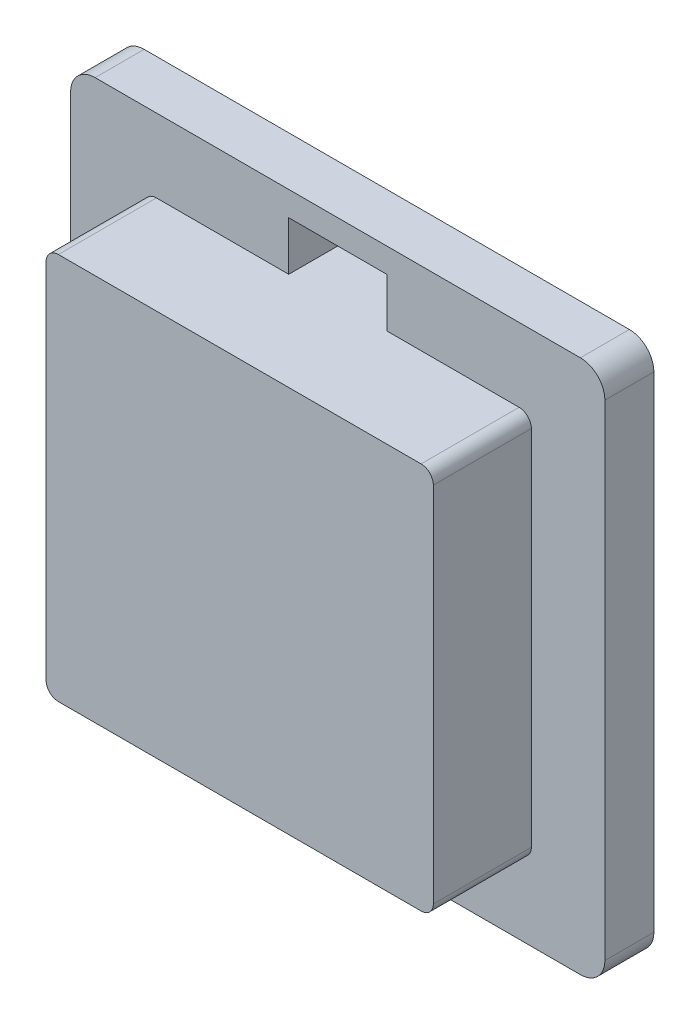
ISO-10303-21;
HEADER;
FILE_DESCRIPTION(('STEP AP214'),'2;1');
FILE_NAME('part.step','',(''),(''),'','','');
FILE_SCHEMA(('AUTOMOTIVE_DESIGN { 1 0 10303 214 1 1 1 1 }'));
ENDSEC;
DATA;
#1=APPLICATION_CONTEXT('core data for automotive mechanical design processes');
#2=APPLICATION_PROTOCOL_DEFINITION('international standard','automotive_design',2000,#1);
#3=PRODUCT_CONTEXT('',#1,'mechanical');
#4=PRODUCT('Part','Part','',(#3));
#5=PRODUCT_RELATED_PRODUCT_CATEGORY('part','',(#4));
#6=PRODUCT_DEFINITION_FORMATION('','',#4);
#7=PRODUCT_DEFINITION_CONTEXT('part definition',#1,'design');
#8=PRODUCT_DEFINITION('design','',#6,#7);
#9=PRODUCT_DEFINITION_SHAPE('','',#8);
#10=(LENGTH_UNIT() NAMED_UNIT(*) SI_UNIT(.MILLI.,.METRE.));
#11=(NAMED_UNIT(*) PLANE_ANGLE_UNIT() SI_UNIT($,.RADIAN.));
#12=(NAMED_UNIT(*) SI_UNIT($,.STERADIAN.) SOLID_ANGLE_UNIT());
#13=UNCERTAINTY_MEASURE_WITH_UNIT(LENGTH_MEASURE(1.E-05),#10,'distance_accuracy_value','');
#14=(GEOMETRIC_REPRESENTATION_CONTEXT(3) GLOBAL_UNCERTAINTY_ASSIGNED_CONTEXT((#13)) GLOBAL_UNIT_ASSIGNED_CONTEXT((#10,
#11,#12)) REPRESENTATION_CONTEXT('',''));
#15=CARTESIAN_POINT('',(0.,0.,0.));
#16=DIRECTION('',(0.,0.,1.));
#17=DIRECTION('',(1.,0.,0.));
#18=AXIS2_PLACEMENT_3D('',#15,#16,#17);
#19=CARTESIAN_POINT('',(2.5,-2.5,3.));
#20=DIRECTION('',(0.,0.,1.));
#21=DIRECTION('',(1.,0.,0.));
#22=AXIS2_PLACEMENT_3D('',#19,#20,#21);
#23=CYLINDRICAL_SURFACE('',#22,0.5);
#24=CARTESIAN_POINT('',(2.5,-2.5,3.));
#25=DIRECTION('',(0.,0.,1.));
#26=DIRECTION('',(1.,0.,0.));
#27=AXIS2_PLACEMENT_3D('',#24,#25,#26);
#28=CIRCLE('',#27,0.5);
#29=CARTESIAN_POINT('',(2.5,-2.,3.));
#30=VERTEX_POINT('',#29);
#31=CARTESIAN_POINT('',(2.,-2.5,3.));
#32=VERTEX_POINT('',#31);
#33=EDGE_CURVE('E172',#30,#32,#28,.T.);
#34=ORIENTED_EDGE('',*,*,#33,.F.);
#35=DIRECTION('',(0.,0.,-1.));
#36=VECTOR('',#35,1.);
#37=CARTESIAN_POINT('',(2.5,-2.,3.));
#38=LINE('',#37,#36);
#39=CARTESIAN_POINT('',(2.5,-2.,-1.));
#40=VERTEX_POINT('',#39);
#41=EDGE_CURVE('E25',#30,#40,#38,.T.);
#42=ORIENTED_EDGE('',*,*,#41,.T.);
#43=CARTESIAN_POINT('',(2.5,-2.5,-1.));
#44=DIRECTION('',(0.,0.,1.));
#45=DIRECTION('',(1.,0.,0.));
#46=AXIS2_PLACEMENT_3D('',#43,#44,#45);
#47=CIRCLE('',#46,0.5);
#48=CARTESIAN_POINT('',(2.,-2.5,-1.));
#49=VERTEX_POINT('',#48);
#50=EDGE_CURVE('E263',#40,#49,#47,.T.);
#51=ORIENTED_EDGE('',*,*,#50,.T.);
#52=DIRECTION('',(0.,0.,-1.));
#53=VECTOR('',#52,1.);
#54=CARTESIAN_POINT('',(2.,-2.5,3.));
#55=LINE('',#54,#53);
#56=EDGE_CURVE('E177',#32,#49,#55,.T.);
#57=ORIENTED_EDGE('',*,*,#56,.F.);
#58=EDGE_LOOP('',(#34,#42,#51,#57));
#59=FACE_BOUND('',#58,.T.);
#60=ADVANCED_FACE('F16',(#59),#23,.T.);
#61=CARTESIAN_POINT('',(17.3,-2.5,3.));
#62=DIRECTION('',(0.,0.,1.));
#63=DIRECTION('',(1.,0.,0.));
#64=AXIS2_PLACEMENT_3D('',#61,#62,#63);
#65=CYLINDRICAL_SURFACE('',#64,0.5);
#66=CARTESIAN_POINT('',(17.3,-2.5,3.));
#67=DIRECTION('',(0.,0.,1.));
#68=DIRECTION('',(1.,0.,0.));
#69=AXIS2_PLACEMENT_3D('',#66,#67,#68);
#70=CIRCLE('',#69,0.5);
#71=CARTESIAN_POINT('',(17.8,-2.5,3.));
#72=VERTEX_POINT('',#71);
#73=CARTESIAN_POINT('',(17.3,-2.,3.));
#74=VERTEX_POINT('',#73);
#75=EDGE_CURVE('E208',#72,#74,#70,.T.);
#76=ORIENTED_EDGE('',*,*,#75,.F.);
#77=DIRECTION('',(0.,0.,-1.));
#78=VECTOR('',#77,1.);
#79=CARTESIAN_POINT('',(17.8,-2.5,3.));
#80=LINE('',#79,#78);
#81=CARTESIAN_POINT('',(17.8,-2.5,-1.));
#82=VERTEX_POINT('',#81);
#83=EDGE_CURVE('E241',#72,#82,#80,.T.);
#84=ORIENTED_EDGE('',*,*,#83,.T.);
#85=CARTESIAN_POINT('',(17.3,-2.5,-1.));
#86=DIRECTION('',(0.,0.,1.));
#87=DIRECTION('',(1.,0.,0.));
#88=AXIS2_PLACEMENT_3D('',#85,#86,#87);
#89=CIRCLE('',#88,0.5);
#90=CARTESIAN_POINT('',(17.3,-2.,-1.));
#91=VERTEX_POINT('',#90);
#92=EDGE_CURVE('E279',#82,#91,#89,.T.);
#93=ORIENTED_EDGE('',*,*,#92,.T.);
#94=DIRECTION('',(0.,0.,-1.));
#95=VECTOR('',#94,1.);
#96=CARTESIAN_POINT('',(17.3,-2.,3.));
#97=LINE('',#96,#95);
#98=EDGE_CURVE('E10',#74,#91,#97,.T.);
#99=ORIENTED_EDGE('',*,*,#98,.F.);
#100=EDGE_LOOP('',(#76,#84,#93,#99));
#101=FACE_BOUND('',#100,.T.);
#102=ADVANCED_FACE('F722',(#101),#65,.T.);
#103=CARTESIAN_POINT('',(17.3,-17.3,3.));
#104=DIRECTION('',(0.,0.,1.));
#105=DIRECTION('',(1.,0.,0.));
#106=AXIS2_PLACEMENT_3D('',#103,#104,#105);
#107=CYLINDRICAL_SURFACE('',#106,0.5);
#108=CARTESIAN_POINT('',(17.3,-17.3,3.));
#109=DIRECTION('',(0.,0.,1.));
#110=DIRECTION('',(1.,0.,0.));
#111=AXIS2_PLACEMENT_3D('',#108,#109,#110);
#112=CIRCLE('',#111,0.5);
#113=CARTESIAN_POINT('',(17.3,-17.8,3.));
#114=VERTEX_POINT('',#113);
#115=CARTESIAN_POINT('',(17.8,-17.3,3.));
#116=VERTEX_POINT('',#115);
#117=EDGE_CURVE('E191',#114,#116,#112,.T.);
#118=ORIENTED_EDGE('',*,*,#117,.F.);
#119=DIRECTION('',(0.,0.,-1.));
#120=VECTOR('',#119,1.);
#121=CARTESIAN_POINT('',(17.3,-17.8,3.));
#122=LINE('',#121,#120);
#123=CARTESIAN_POINT('',(17.3,-17.8,-1.));
#124=VERTEX_POINT('',#123);
#125=EDGE_CURVE('E136',#114,#124,#122,.T.);
#126=ORIENTED_EDGE('',*,*,#125,.T.);
#127=CARTESIAN_POINT('',(17.3,-17.3,-1.));
#128=DIRECTION('',(0.,0.,1.));
#129=DIRECTION('',(1.,0.,0.));
#130=AXIS2_PLACEMENT_3D('',#127,#128,#129);
#131=CIRCLE('',#130,0.5);
#132=CARTESIAN_POINT('',(17.8,-17.3,-1.));
#133=VERTEX_POINT('',#132);
#134=EDGE_CURVE('E287',#124,#133,#131,.T.);
#135=ORIENTED_EDGE('',*,*,#134,.T.);
#136=DIRECTION('',(0.,0.,-1.));
#137=VECTOR('',#136,1.);
#138=CARTESIAN_POINT('',(17.8,-17.3,3.));
#139=LINE('',#138,#137);
#140=EDGE_CURVE('E186',#116,#133,#139,.T.);
#141=ORIENTED_EDGE('',*,*,#140,.F.);
#142=EDGE_LOOP('',(#118,#126,#135,#141));
#143=FACE_BOUND('',#142,.T.);
#144=ADVANCED_FACE('F376',(#143),#107,.T.);
#145=CARTESIAN_POINT('',(2.5,-17.3,3.));
#146=DIRECTION('',(0.,0.,1.));
#147=DIRECTION('',(1.,0.,0.));
#148=AXIS2_PLACEMENT_3D('',#145,#146,#147);
#149=CYLINDRICAL_SURFACE('',#148,0.5);
#150=CARTESIAN_POINT('',(2.5,-17.3,3.));
#151=DIRECTION('',(0.,0.,1.));
#152=DIRECTION('',(1.,0.,0.));
#153=AXIS2_PLACEMENT_3D('',#150,#151,#152);
#154=CIRCLE('',#153,0.5);
#155=CARTESIAN_POINT('',(2.,-17.3,3.));
#156=VERTEX_POINT('',#155);
#157=CARTESIAN_POINT('',(2.5,-17.8,3.));
#158=VERTEX_POINT('',#157);
#159=EDGE_CURVE('E166',#156,#158,#154,.T.);
#160=ORIENTED_EDGE('',*,*,#159,.F.);
#161=DIRECTION('',(0.,0.,-1.));
#162=VECTOR('',#161,1.);
#163=CARTESIAN_POINT('',(2.,-17.3,3.));
#164=LINE('',#163,#162);
#165=CARTESIAN_POINT('',(2.,-17.3,-1.));
#166=VERTEX_POINT('',#165);
#167=EDGE_CURVE('E173',#156,#166,#164,.T.);
#168=ORIENTED_EDGE('',*,*,#167,.T.);
#169=CARTESIAN_POINT('',(2.5,-17.3,-1.));
#170=DIRECTION('',(0.,0.,1.));
#171=DIRECTION('',(1.,0.,0.));
#172=AXIS2_PLACEMENT_3D('',#169,#170,#171);
#173=CIRCLE('',#172,0.5);
#174=CARTESIAN_POINT('',(2.5,-17.8,-1.));
#175=VERTEX_POINT('',#174);
#176=EDGE_CURVE('E295',#166,#175,#173,.T.);
#177=ORIENTED_EDGE('',*,*,#176,.T.);
#178=DIRECTION('',(0.,0.,-1.));
#179=VECTOR('',#178,1.);
#180=CARTESIAN_POINT('',(2.5,-17.8,3.));
#181=LINE('',#180,#179);
#182=EDGE_CURVE('E19',#158,#175,#181,.T.);
#183=ORIENTED_EDGE('',*,*,#182,.F.);
#184=EDGE_LOOP('',(#160,#168,#177,#183));
#185=FACE_BOUND('',#184,.T.);
#186=ADVANCED_FACE('F366',(#185),#149,.T.);
#187=CARTESIAN_POINT('',(9.9,-2.,0.519230769231));
#188=DIRECTION('',(0.,1.,0.));
#189=DIRECTION('',(1.,0.,0.));
#190=AXIS2_PLACEMENT_3D('',#187,#188,#189);
#191=PLANE('',#190);
#192=DIRECTION('',(-1.,0.,0.));
#193=VECTOR('',#192,1.);
#194=CARTESIAN_POINT('',(17.3,-2.,-1.));
#195=LINE('',#194,#193);
#196=CARTESIAN_POINT('',(11.9,-2.,-1.));
#197=VERTEX_POINT('',#196);
#198=EDGE_CURVE('E276',#91,#197,#195,.T.);
#199=ORIENTED_EDGE('',*,*,#198,.T.);
#200=DIRECTION('',(0.,0.,-1.));
#201=VECTOR('',#200,1.);
#202=CARTESIAN_POINT('',(11.9,-2.,1.));
#203=LINE('',#202,#201);
#204=CARTESIAN_POINT('',(11.9,-2.,-3.));
#205=VERTEX_POINT('',#204);
#206=EDGE_CURVE('E150',#197,#205,#203,.T.);
#207=ORIENTED_EDGE('',*,*,#206,.T.);
#208=DIRECTION('',(1.,0.,0.));
#209=VECTOR('',#208,1.);
#210=CARTESIAN_POINT('',(8.9,-2.,-3.));
#211=LINE('',#210,#209);
#212=CARTESIAN_POINT('',(7.9,-2.,-3.));
#213=VERTEX_POINT('',#212);
#214=EDGE_CURVE('E143',#213,#205,#211,.T.);
#215=ORIENTED_EDGE('',*,*,#214,.F.);
#216=DIRECTION('',(0.,0.,-1.));
#217=VECTOR('',#216,1.);
#218=CARTESIAN_POINT('',(7.9,-2.,1.));
#219=LINE('',#218,#217);
#220=CARTESIAN_POINT('',(7.9,-2.,-1.));
#221=VERTEX_POINT('',#220);
#222=EDGE_CURVE('E124',#221,#213,#219,.T.);
#223=ORIENTED_EDGE('',*,*,#222,.F.);
#224=DIRECTION('',(-1.,0.,0.));
#225=VECTOR('',#224,1.);
#226=CARTESIAN_POINT('',(17.3,-2.,-1.));
#227=LINE('',#226,#225);
#228=EDGE_CURVE('E221',#221,#40,#227,.T.);
#229=ORIENTED_EDGE('',*,*,#228,.T.);
#230=ORIENTED_EDGE('',*,*,#41,.F.);
#231=DIRECTION('',(-1.,0.,0.));
#232=VECTOR('',#231,1.);
#233=CARTESIAN_POINT('',(17.3,-2.,3.));
#234=LINE('',#233,#232);
#235=EDGE_CURVE('E178',#74,#30,#234,.T.);
#236=ORIENTED_EDGE('',*,*,#235,.F.);
#237=ORIENTED_EDGE('',*,*,#98,.T.);
#238=EDGE_LOOP('',(#199,#207,#215,#223,#229,#230,#236,#237));
#239=FACE_BOUND('',#238,.T.);
#240=ADVANCED_FACE('F149',(#239),#191,.T.);
#241=CARTESIAN_POINT('',(17.8,-9.9,1.));
#242=DIRECTION('',(1.,0.,0.));
#243=DIRECTION('',(0.,1.,0.));
#244=AXIS2_PLACEMENT_3D('',#241,#242,#243);
#245=PLANE('',#244);
#246=ORIENTED_EDGE('',*,*,#83,.F.);
#247=DIRECTION('',(0.,1.,0.));
#248=VECTOR('',#247,1.);
#249=CARTESIAN_POINT('',(17.8,-17.3,3.));
#250=LINE('',#249,#248);
#251=EDGE_CURVE('E199',#116,#72,#250,.T.);
#252=ORIENTED_EDGE('',*,*,#251,.F.);
#253=ORIENTED_EDGE('',*,*,#140,.T.);
#254=DIRECTION('',(0.,1.,0.));
#255=VECTOR('',#254,1.);
#256=CARTESIAN_POINT('',(17.8,-17.3,-1.));
#257=LINE('',#256,#255);
#258=EDGE_CURVE('E283',#133,#82,#257,.T.);
#259=ORIENTED_EDGE('',*,*,#258,.T.);
#260=EDGE_LOOP('',(#246,#252,#253,#259));
#261=FACE_BOUND('',#260,.T.);
#262=ADVANCED_FACE('F385',(#261),#245,.T.);
#263=CARTESIAN_POINT('',(9.9,-17.8,1.));
#264=DIRECTION('',(0.,-1.,0.));
#265=DIRECTION('',(0.,0.,-1.));
#266=AXIS2_PLACEMENT_3D('',#263,#264,#265);
#267=PLANE('',#266);
#268=ORIENTED_EDGE('',*,*,#125,.F.);
#269=DIRECTION('',(1.,0.,0.));
#270=VECTOR('',#269,1.);
#271=CARTESIAN_POINT('',(2.5,-17.8,3.));
#272=LINE('',#271,#270);
#273=EDGE_CURVE('E187',#158,#114,#272,.T.);
#274=ORIENTED_EDGE('',*,*,#273,.F.);
#275=ORIENTED_EDGE('',*,*,#182,.T.);
#276=DIRECTION('',(1.,0.,0.));
#277=VECTOR('',#276,1.);
#278=CARTESIAN_POINT('',(2.5,-17.8,-1.));
#279=LINE('',#278,#277);
#280=EDGE_CURVE('E291',#175,#124,#279,.T.);
#281=ORIENTED_EDGE('',*,*,#280,.T.);
#282=EDGE_LOOP('',(#268,#274,#275,#281));
#283=FACE_BOUND('',#282,.T.);
#284=ADVANCED_FACE('F358',(#283),#267,.T.);
#285=CARTESIAN_POINT('',(7.9,0.,1.));
#286=DIRECTION('',(-1.,0.,0.));
#287=DIRECTION('',(0.,0.,1.));
#288=AXIS2_PLACEMENT_3D('',#285,#286,#287);
#289=PLANE('',#288);
#290=DIRECTION('',(0.,-1.,0.));
#291=VECTOR('',#290,1.);
#292=CARTESIAN_POINT('',(7.9,-4.95,-3.));
#293=LINE('',#292,#291);
#294=CARTESIAN_POINT('',(7.9,0.,-3.));
#295=VERTEX_POINT('',#294);
#296=EDGE_CURVE('E127',#295,#213,#293,.T.);
#297=ORIENTED_EDGE('',*,*,#296,.F.);
#298=DIRECTION('',(0.,0.,-1.));
#299=VECTOR('',#298,1.);
#300=CARTESIAN_POINT('',(7.9,0.,1.));
#301=LINE('',#300,#299);
#302=CARTESIAN_POINT('',(7.9,0.,-1.));
#303=VERTEX_POINT('',#302);
#304=EDGE_CURVE('E38',#303,#295,#301,.T.);
#305=ORIENTED_EDGE('',*,*,#304,.F.);
#306=DIRECTION('',(0.,1.,0.));
#307=VECTOR('',#306,1.);
#308=CARTESIAN_POINT('',(7.9,-4.985776389726,-1.));
#309=LINE('',#308,#307);
#310=EDGE_CURVE('E130',#221,#303,#309,.T.);
#311=ORIENTED_EDGE('',*,*,#310,.F.);
#312=ORIENTED_EDGE('',*,*,#222,.T.);
#313=EDGE_LOOP('',(#297,#305,#311,#312));
#314=FACE_BOUND('',#313,.T.);
#315=ADVANCED_FACE('F126',(#314),#289,.F.);
#316=CARTESIAN_POINT('',(11.9,0.,1.));
#317=DIRECTION('',(0.,1.,0.));
#318=DIRECTION('',(1.,0.,0.));
#319=AXIS2_PLACEMENT_3D('',#316,#317,#318);
#320=PLANE('',#319);
#321=ORIENTED_EDGE('',*,*,#304,.T.);
#322=DIRECTION('',(-1.,0.,0.));
#323=VECTOR('',#322,1.);
#324=CARTESIAN_POINT('',(10.9,0.,-3.));
#325=LINE('',#324,#323);
#326=CARTESIAN_POINT('',(11.9,0.,-3.));
#327=VERTEX_POINT('',#326);
#328=EDGE_CURVE('E144',#327,#295,#325,.T.);
#329=ORIENTED_EDGE('',*,*,#328,.F.);
#330=DIRECTION('',(0.,0.,-1.));
#331=VECTOR('',#330,1.);
#332=CARTESIAN_POINT('',(11.9,0.,1.));
#333=LINE('',#332,#331);
#334=CARTESIAN_POINT('',(11.9,0.,-1.));
#335=VERTEX_POINT('',#334);
#336=EDGE_CURVE('E51',#335,#327,#333,.T.);
#337=ORIENTED_EDGE('',*,*,#336,.F.);
#338=DIRECTION('',(1.,0.,0.));
#339=VECTOR('',#338,1.);
#340=CARTESIAN_POINT('',(10.977790201321,0.,-1.));
#341=LINE('',#340,#339);
#342=EDGE_CURVE('E220',#303,#335,#341,.T.);
#343=ORIENTED_EDGE('',*,*,#342,.F.);
#344=EDGE_LOOP('',(#321,#329,#337,#343));
#345=FACE_BOUND('',#344,.T.);
#346=ADVANCED_FACE('F684',(#345),#320,.F.);
#347=CARTESIAN_POINT('',(11.9,-2.,1.));
#348=DIRECTION('',(1.,0.,0.));
#349=DIRECTION('',(0.,1.,0.));
#350=AXIS2_PLACEMENT_3D('',#347,#348,#349);
#351=PLANE('',#350);
#352=ORIENTED_EDGE('',*,*,#336,.T.);
#353=DIRECTION('',(0.,1.,0.));
#354=VECTOR('',#353,1.);
#355=CARTESIAN_POINT('',(11.9,-5.95,-3.));
#356=LINE('',#355,#354);
#357=EDGE_CURVE('E152',#205,#327,#356,.T.);
#358=ORIENTED_EDGE('',*,*,#357,.F.);
#359=ORIENTED_EDGE('',*,*,#206,.F.);
#360=DIRECTION('',(0.,-1.,0.));
#361=VECTOR('',#360,1.);
#362=CARTESIAN_POINT('',(11.9,-5.985776389726,-1.));
#363=LINE('',#362,#361);
#364=EDGE_CURVE('E272',#335,#197,#363,.T.);
#365=ORIENTED_EDGE('',*,*,#364,.F.);
#366=EDGE_LOOP('',(#352,#358,#359,#365));
#367=FACE_BOUND('',#366,.T.);
#368=ADVANCED_FACE('F695',(#367),#351,.F.);
#369=CARTESIAN_POINT('',(-1.,-20.8,0.));
#370=DIRECTION('',(1.,0.,0.));
#371=DIRECTION('',(0.,1.,0.));
#372=AXIS2_PLACEMENT_3D('',#369,#370,#371);
#373=PLANE('',#372);
#374=DIRECTION('',(0.,0.,-1.));
#375=VECTOR('',#374,1.);
#376=CARTESIAN_POINT('',(-1.,0.,0.));
#377=LINE('',#376,#375);
#378=CARTESIAN_POINT('',(-1.,0.,-1.));
#379=VERTEX_POINT('',#378);
#380=CARTESIAN_POINT('',(-1.,0.,-3.));
#381=VERTEX_POINT('',#380);
#382=EDGE_CURVE('E146',#379,#381,#377,.T.);
#383=ORIENTED_EDGE('',*,*,#382,.T.);
#384=DIRECTION('',(0.,1.,0.));
#385=VECTOR('',#384,1.);
#386=CARTESIAN_POINT('',(-1.,-20.8,-3.));
#387=LINE('',#386,#385);
#388=CARTESIAN_POINT('',(-1.,-19.8,-3.));
#389=VERTEX_POINT('',#388);
#390=EDGE_CURVE('E162',#389,#381,#387,.T.);
#391=ORIENTED_EDGE('',*,*,#390,.F.);
#392=DIRECTION('',(0.,0.,-1.));
#393=VECTOR('',#392,1.);
#394=CARTESIAN_POINT('',(-1.,-19.8,0.));
#395=LINE('',#394,#393);
#396=CARTESIAN_POINT('',(-1.,-19.8,-1.));
#397=VERTEX_POINT('',#396);
#398=EDGE_CURVE('E340',#397,#389,#395,.T.);
#399=ORIENTED_EDGE('',*,*,#398,.F.);
#400=DIRECTION('',(0.,-1.,0.));
#401=VECTOR('',#400,1.);
#402=CARTESIAN_POINT('',(-1.,-15.38577638972,-1.));
#403=LINE('',#402,#401);
#404=EDGE_CURVE('E245',#379,#397,#403,.T.);
#405=ORIENTED_EDGE('',*,*,#404,.F.);
#406=EDGE_LOOP('',(#383,#391,#399,#405));
#407=FACE_BOUND('',#406,.T.);
#408=ADVANCED_FACE('F702',(#407),#373,.F.);
#409=CARTESIAN_POINT('',(0.,-19.8,0.));
#410=DIRECTION('',(0.,0.,-1.));
#411=DIRECTION('',(-1.,0.,0.));
#412=AXIS2_PLACEMENT_3D('',#409,#410,#411);
#413=CYLINDRICAL_SURFACE('',#412,1.);
#414=CARTESIAN_POINT('',(0.,-19.8,-3.));
#415=DIRECTION('',(0.,0.,1.));
#416=DIRECTION('',(0.,1.,0.));
#417=AXIS2_PLACEMENT_3D('',#414,#415,#416);
#418=CIRCLE('',#417,1.);
#419=CARTESIAN_POINT('',(0.,-20.8,-3.));
#420=VERTEX_POINT('',#419);
#421=EDGE_CURVE('E256',#389,#420,#418,.T.);
#422=ORIENTED_EDGE('',*,*,#421,.T.);
#423=DIRECTION('',(0.,0.,-1.));
#424=VECTOR('',#423,1.);
#425=CARTESIAN_POINT('',(0.,-20.8,0.));
#426=LINE('',#425,#424);
#427=CARTESIAN_POINT('',(0.,-20.8,-1.));
#428=VERTEX_POINT('',#427);
#429=EDGE_CURVE('E336',#428,#420,#426,.T.);
#430=ORIENTED_EDGE('',*,*,#429,.F.);
#431=CARTESIAN_POINT('',(0.,-19.8,-1.));
#432=DIRECTION('',(0.,0.,-1.));
#433=DIRECTION('',(-1.,0.,0.));
#434=AXIS2_PLACEMENT_3D('',#431,#432,#433);
#435=CIRCLE('',#434,1.);
#436=EDGE_CURVE('E249',#428,#397,#435,.T.);
#437=ORIENTED_EDGE('',*,*,#436,.T.);
#438=ORIENTED_EDGE('',*,*,#398,.T.);
#439=EDGE_LOOP('',(#422,#430,#437,#438));
#440=FACE_BOUND('',#439,.T.);
#441=ADVANCED_FACE('F707',(#440),#413,.T.);
#442=CARTESIAN_POINT('',(20.8,-20.8,0.));
#443=DIRECTION('',(0.,1.,0.));
#444=DIRECTION('',(1.,0.,0.));
#445=AXIS2_PLACEMENT_3D('',#442,#443,#444);
#446=PLANE('',#445);
#447=ORIENTED_EDGE('',*,*,#429,.T.);
#448=DIRECTION('',(-1.,0.,0.));
#449=VECTOR('',#448,1.);
#450=CARTESIAN_POINT('',(20.8,-20.8,-3.));
#451=LINE('',#450,#449);
#452=CARTESIAN_POINT('',(19.8,-20.8,-3.));
#453=VERTEX_POINT('',#452);
#454=EDGE_CURVE('E317',#453,#420,#451,.T.);
#455=ORIENTED_EDGE('',*,*,#454,.F.);
#456=DIRECTION('',(0.,0.,-1.));
#457=VECTOR('',#456,1.);
#458=CARTESIAN_POINT('',(19.8,-20.8,0.));
#459=LINE('',#458,#457);
#460=CARTESIAN_POINT('',(19.8,-20.8,-1.));
#461=VERTEX_POINT('',#460);
#462=EDGE_CURVE('E333',#461,#453,#459,.T.);
#463=ORIENTED_EDGE('',*,*,#462,.F.);
#464=DIRECTION('',(1.,0.,0.));
#465=VECTOR('',#464,1.);
#466=CARTESIAN_POINT('',(15.427790201321,-20.8,-1.));
#467=LINE('',#466,#465);
#468=EDGE_CURVE('E234',#428,#461,#467,.T.);
#469=ORIENTED_EDGE('',*,*,#468,.F.);
#470=EDGE_LOOP('',(#447,#455,#463,#469));
#471=FACE_BOUND('',#470,.T.);
#472=ADVANCED_FACE('F774',(#471),#446,.F.);
#473=CARTESIAN_POINT('',(19.8,-19.8,0.));
#474=DIRECTION('',(0.,0.,-1.));
#475=DIRECTION('',(1.,0.,0.));
#476=AXIS2_PLACEMENT_3D('',#473,#474,#475);
#477=CYLINDRICAL_SURFACE('',#476,1.);
#478=DIRECTION('',(0.,0.,-1.));
#479=VECTOR('',#478,1.);
#480=CARTESIAN_POINT('',(20.8,-19.8,0.));
#481=LINE('',#480,#479);
#482=CARTESIAN_POINT('',(20.8,-19.8,-1.));
#483=VERTEX_POINT('',#482);
#484=CARTESIAN_POINT('',(20.8,-19.8,-3.));
#485=VERTEX_POINT('',#484);
#486=EDGE_CURVE('E330',#483,#485,#481,.T.);
#487=ORIENTED_EDGE('',*,*,#486,.F.);
#488=CARTESIAN_POINT('',(19.8,-19.8,-1.));
#489=DIRECTION('',(0.,0.,-1.));
#490=DIRECTION('',(1.,0.,0.));
#491=AXIS2_PLACEMENT_3D('',#488,#489,#490);
#492=CIRCLE('',#491,1.);
#493=EDGE_CURVE('E229',#483,#461,#492,.T.);
#494=ORIENTED_EDGE('',*,*,#493,.T.);
#495=ORIENTED_EDGE('',*,*,#462,.T.);
#496=CARTESIAN_POINT('',(19.8,-19.8,-3.));
#497=DIRECTION('',(0.,0.,-1.));
#498=DIRECTION('',(0.,1.,0.));
#499=AXIS2_PLACEMENT_3D('',#496,#497,#498);
#500=CIRCLE('',#499,1.);
#501=EDGE_CURVE('E311',#485,#453,#500,.T.);
#502=ORIENTED_EDGE('',*,*,#501,.F.);
#503=EDGE_LOOP('',(#487,#494,#495,#502));
#504=FACE_BOUND('',#503,.T.);
#505=ADVANCED_FACE('F757',(#504),#477,.T.);
#506=CARTESIAN_POINT('',(20.8,1.,0.));
#507=DIRECTION('',(-1.,0.,0.));
#508=DIRECTION('',(0.,0.,1.));
#509=AXIS2_PLACEMENT_3D('',#506,#507,#508);
#510=PLANE('',#509);
#511=ORIENTED_EDGE('',*,*,#486,.T.);
#512=DIRECTION('',(0.,-1.,0.));
#513=VECTOR('',#512,1.);
#514=CARTESIAN_POINT('',(20.8,1.,-3.));
#515=LINE('',#514,#513);
#516=CARTESIAN_POINT('',(20.8,0.,-3.));
#517=VERTEX_POINT('',#516);
#518=EDGE_CURVE('E307',#517,#485,#515,.T.);
#519=ORIENTED_EDGE('',*,*,#518,.F.);
#520=DIRECTION('',(0.,0.,-1.));
#521=VECTOR('',#520,1.);
#522=CARTESIAN_POINT('',(20.8,0.,0.));
#523=LINE('',#522,#521);
#524=CARTESIAN_POINT('',(20.8,0.,-1.));
#525=VERTEX_POINT('',#524);
#526=EDGE_CURVE('E299',#525,#517,#523,.T.);
#527=ORIENTED_EDGE('',*,*,#526,.F.);
#528=DIRECTION('',(0.,1.,0.));
#529=VECTOR('',#528,1.);
#530=CARTESIAN_POINT('',(20.8,-4.485776389726,-1.));
#531=LINE('',#530,#529);
#532=EDGE_CURVE('E233',#483,#525,#531,.T.);
#533=ORIENTED_EDGE('',*,*,#532,.F.);
#534=EDGE_LOOP('',(#511,#519,#527,#533));
#535=FACE_BOUND('',#534,.T.);
#536=ADVANCED_FACE('F747',(#535),#510,.F.);
#537=CARTESIAN_POINT('',(0.,0.,0.));
#538=DIRECTION('',(0.,0.,-1.));
#539=DIRECTION('',(0.,1.,0.));
#540=AXIS2_PLACEMENT_3D('',#537,#538,#539);
#541=CYLINDRICAL_SURFACE('',#540,1.);
#542=CARTESIAN_POINT('',(0.,0.,-3.));
#543=DIRECTION('',(0.,0.,1.));
#544=DIRECTION('',(0.,1.,0.));
#545=AXIS2_PLACEMENT_3D('',#542,#543,#544);
#546=CIRCLE('',#545,1.);
#547=CARTESIAN_POINT('',(0.,1.,-3.));
#548=VERTEX_POINT('',#547);
#549=EDGE_CURVE('E153',#548,#381,#546,.T.);
#550=ORIENTED_EDGE('',*,*,#549,.T.);
#551=ORIENTED_EDGE('',*,*,#382,.F.);
#552=CARTESIAN_POINT('',(0.,0.,-1.));
#553=DIRECTION('',(0.,0.,-1.));
#554=DIRECTION('',(0.,1.,0.));
#555=AXIS2_PLACEMENT_3D('',#552,#553,#554);
#556=CIRCLE('',#555,1.);
#557=CARTESIAN_POINT('',(0.,1.,-1.));
#558=VERTEX_POINT('',#557);
#559=EDGE_CURVE('E238',#379,#558,#556,.T.);
#560=ORIENTED_EDGE('',*,*,#559,.T.);
#561=DIRECTION('',(0.,0.,-1.));
#562=VECTOR('',#561,1.);
#563=CARTESIAN_POINT('',(0.,1.,0.));
#564=LINE('',#563,#562);
#565=EDGE_CURVE('E196',#558,#548,#564,.T.);
#566=ORIENTED_EDGE('',*,*,#565,.T.);
#567=EDGE_LOOP('',(#550,#551,#560,#566));
#568=FACE_BOUND('',#567,.T.);
#569=ADVANCED_FACE('F641',(#568),#541,.T.);
#570=CARTESIAN_POINT('',(9.9,-9.9,-3.));
#571=DIRECTION('',(0.,0.,1.));
#572=DIRECTION('',(1.,0.,0.));
#573=AXIS2_PLACEMENT_3D('',#570,#571,#572);
#574=PLANE('',#573);
#575=ORIENTED_EDGE('',*,*,#214,.T.);
#576=ORIENTED_EDGE('',*,*,#357,.T.);
#577=ORIENTED_EDGE('',*,*,#328,.T.);
#578=ORIENTED_EDGE('',*,*,#296,.T.);
#579=EDGE_LOOP('',(#575,#576,#577,#578));
#580=FACE_BOUND('',#579,.T.);
#581=CARTESIAN_POINT('',(19.8,0.,-3.));
#582=DIRECTION('',(0.,0.,-1.));
#583=DIRECTION('',(0.,1.,0.));
#584=AXIS2_PLACEMENT_3D('',#581,#582,#583);
#585=CIRCLE('',#584,1.);
#586=CARTESIAN_POINT('',(19.8,1.,-3.));
#587=VERTEX_POINT('',#586);
#588=EDGE_CURVE('E303',#587,#517,#585,.T.);
#589=ORIENTED_EDGE('',*,*,#588,.T.);
#590=ORIENTED_EDGE('',*,*,#518,.T.);
#591=ORIENTED_EDGE('',*,*,#501,.T.);
#592=ORIENTED_EDGE('',*,*,#454,.T.);
#593=ORIENTED_EDGE('',*,*,#421,.F.);
#594=ORIENTED_EDGE('',*,*,#390,.T.);
#595=ORIENTED_EDGE('',*,*,#549,.F.);
#596=DIRECTION('',(1.,0.,0.));
#597=VECTOR('',#596,1.);
#598=CARTESIAN_POINT('',(-1.,1.,-3.));
#599=LINE('',#598,#597);
#600=EDGE_CURVE('E192',#548,#587,#599,.T.);
#601=ORIENTED_EDGE('',*,*,#600,.T.);
#602=EDGE_LOOP('',(#589,#590,#591,#592,#593,#594,#595,#601));
#603=FACE_BOUND('',#602,.T.);
#604=ADVANCED_FACE('F140',(#580,#603),#574,.F.);
#605=CARTESIAN_POINT('',(19.8,0.,0.));
#606=DIRECTION('',(0.,0.,-1.));
#607=DIRECTION('',(0.,1.,0.));
#608=AXIS2_PLACEMENT_3D('',#605,#606,#607);
#609=CYLINDRICAL_SURFACE('',#608,1.);
#610=DIRECTION('',(0.,0.,-1.));
#611=VECTOR('',#610,1.);
#612=CARTESIAN_POINT('',(19.8,1.,0.));
#613=LINE('',#612,#611);
#614=CARTESIAN_POINT('',(19.8,1.,-1.));
#615=VERTEX_POINT('',#614);
#616=EDGE_CURVE('E183',#615,#587,#613,.T.);
#617=ORIENTED_EDGE('',*,*,#616,.F.);
#618=CARTESIAN_POINT('',(19.8,0.,-1.));
#619=DIRECTION('',(0.,0.,-1.));
#620=DIRECTION('',(0.,1.,0.));
#621=AXIS2_PLACEMENT_3D('',#618,#619,#620);
#622=CIRCLE('',#621,1.);
#623=EDGE_CURVE('E228',#615,#525,#622,.T.);
#624=ORIENTED_EDGE('',*,*,#623,.T.);
#625=ORIENTED_EDGE('',*,*,#526,.T.);
#626=ORIENTED_EDGE('',*,*,#588,.F.);
#627=EDGE_LOOP('',(#617,#624,#625,#626));
#628=FACE_BOUND('',#627,.T.);
#629=ADVANCED_FACE('F640',(#628),#609,.T.);
#630=CARTESIAN_POINT('',(10.055580402642,-9.971552779451,-1.));
#631=DIRECTION('',(0.,0.,1.));
#632=DIRECTION('',(1.,0.,0.));
#633=AXIS2_PLACEMENT_3D('',#630,#631,#632);
#634=PLANE('',#633);
#635=DIRECTION('',(0.,-1.,0.));
#636=VECTOR('',#635,1.);
#637=CARTESIAN_POINT('',(2.,-2.5,-1.));
#638=LINE('',#637,#636);
#639=EDGE_CURVE('E179',#49,#166,#638,.T.);
#640=ORIENTED_EDGE('',*,*,#639,.F.);
#641=ORIENTED_EDGE('',*,*,#50,.F.);
#642=ORIENTED_EDGE('',*,*,#228,.F.);
#643=ORIENTED_EDGE('',*,*,#310,.T.);
#644=ORIENTED_EDGE('',*,*,#342,.T.);
#645=ORIENTED_EDGE('',*,*,#364,.T.);
#646=ORIENTED_EDGE('',*,*,#198,.F.);
#647=ORIENTED_EDGE('',*,*,#92,.F.);
#648=ORIENTED_EDGE('',*,*,#258,.F.);
#649=ORIENTED_EDGE('',*,*,#134,.F.);
#650=ORIENTED_EDGE('',*,*,#280,.F.);
#651=ORIENTED_EDGE('',*,*,#176,.F.);
#652=EDGE_LOOP('',(#640,#641,#642,#643,#644,#645,#646,#647,#648,#649,#650,#651));
#653=FACE_BOUND('',#652,.T.);
#654=ORIENTED_EDGE('',*,*,#623,.F.);
#655=DIRECTION('',(-1.,0.,0.));
#656=VECTOR('',#655,1.);
#657=CARTESIAN_POINT('',(4.527790201321,1.,-1.));
#658=LINE('',#657,#656);
#659=EDGE_CURVE('E204',#615,#558,#658,.T.);
#660=ORIENTED_EDGE('',*,*,#659,.T.);
#661=ORIENTED_EDGE('',*,*,#559,.F.);
#662=ORIENTED_EDGE('',*,*,#404,.T.);
#663=ORIENTED_EDGE('',*,*,#436,.F.);
#664=ORIENTED_EDGE('',*,*,#468,.T.);
#665=ORIENTED_EDGE('',*,*,#493,.F.);
#666=ORIENTED_EDGE('',*,*,#532,.T.);
#667=EDGE_LOOP('',(#654,#660,#661,#662,#663,#664,#665,#666));
#668=FACE_BOUND('',#667,.T.);
#669=ADVANCED_FACE('F371',(#653,#668),#634,.T.);
#670=CARTESIAN_POINT('',(-1.,1.,0.));
#671=DIRECTION('',(0.,-1.,0.));
#672=DIRECTION('',(0.,0.,-1.));
#673=AXIS2_PLACEMENT_3D('',#670,#671,#672);
#674=PLANE('',#673);
#675=ORIENTED_EDGE('',*,*,#616,.T.);
#676=ORIENTED_EDGE('',*,*,#600,.F.);
#677=ORIENTED_EDGE('',*,*,#565,.F.);
#678=ORIENTED_EDGE('',*,*,#659,.F.);
#679=EDGE_LOOP('',(#675,#676,#677,#678));
#680=FACE_BOUND('',#679,.T.);
#681=ADVANCED_FACE('F663',(#680),#674,.F.);
#682=CARTESIAN_POINT('',(2.,-9.9,1.));
#683=DIRECTION('',(-1.,0.,0.));
#684=DIRECTION('',(0.,0.,1.));
#685=AXIS2_PLACEMENT_3D('',#682,#683,#684);
#686=PLANE('',#685);
#687=ORIENTED_EDGE('',*,*,#167,.F.);
#688=DIRECTION('',(0.,-1.,0.));
#689=VECTOR('',#688,1.);
#690=CARTESIAN_POINT('',(2.,-2.5,3.));
#691=LINE('',#690,#689);
#692=EDGE_CURVE('E168',#32,#156,#691,.T.);
#693=ORIENTED_EDGE('',*,*,#692,.F.);
#694=ORIENTED_EDGE('',*,*,#56,.T.);
#695=ORIENTED_EDGE('',*,*,#639,.T.);
#696=EDGE_LOOP('',(#687,#693,#694,#695));
#697=FACE_BOUND('',#696,.T.);
#698=ADVANCED_FACE('F462',(#697),#686,.T.);
#699=CARTESIAN_POINT('',(9.9,-9.9,3.));
#700=DIRECTION('',(0.,0.,1.));
#701=DIRECTION('',(1.,0.,0.));
#702=AXIS2_PLACEMENT_3D('',#699,#700,#701);
#703=PLANE('',#702);
#704=ORIENTED_EDGE('',*,*,#33,.T.);
#705=ORIENTED_EDGE('',*,*,#692,.T.);
#706=ORIENTED_EDGE('',*,*,#159,.T.);
#707=ORIENTED_EDGE('',*,*,#273,.T.);
#708=ORIENTED_EDGE('',*,*,#117,.T.);
#709=ORIENTED_EDGE('',*,*,#251,.T.);
#710=ORIENTED_EDGE('',*,*,#75,.T.);
#711=ORIENTED_EDGE('',*,*,#235,.T.);
#712=EDGE_LOOP('',(#704,#705,#706,#707,#708,#709,#710,#711));
#713=FACE_BOUND('',#712,.T.);
#714=ADVANCED_FACE('F389',(#713),#703,.T.);
#715=CLOSED_SHELL('',(#60,#102,#144,#186,#240,#262,#284,#315,#346,#368,#408,#441,#472,#505,#536,
#569,#604,#629,#669,#681,#698,#714));
#716=MANIFOLD_SOLID_BREP('B1',#715);
#717=ADVANCED_BREP_SHAPE_REPRESENTATION('',(#18,#716),#14);
#718=SHAPE_DEFINITION_REPRESENTATION(#9,#717);
ENDSEC;
END-ISO-10303-21;
